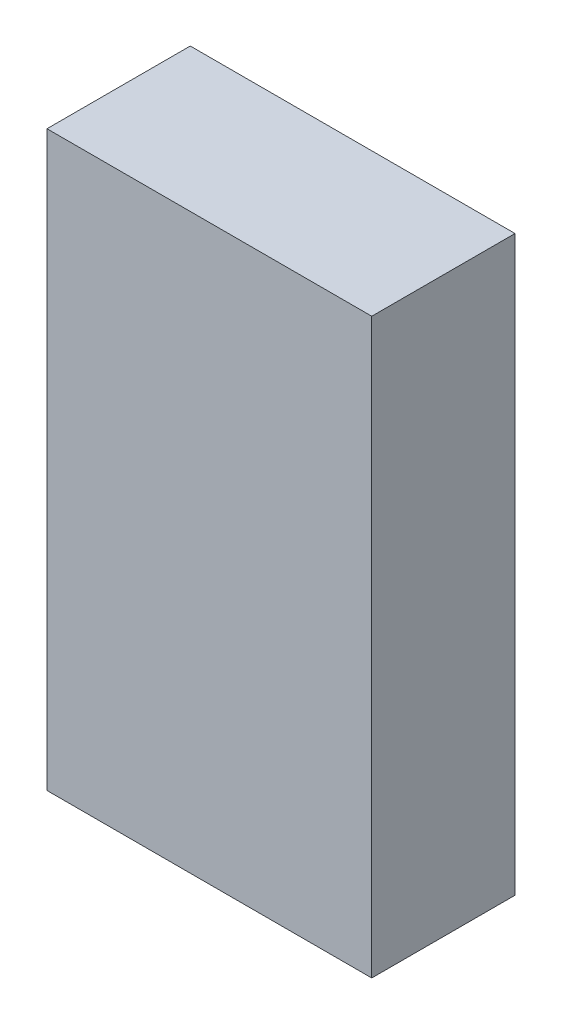
ISO-10303-21;
HEADER;
FILE_DESCRIPTION(('STEP AP214'),'2;1');
FILE_NAME('part.step','',(''),(''),'','','');
FILE_SCHEMA(('AUTOMOTIVE_DESIGN { 1 0 10303 214 1 1 1 1 }'));
ENDSEC;
DATA;
#1=APPLICATION_CONTEXT('core data for automotive mechanical design processes');
#2=APPLICATION_PROTOCOL_DEFINITION('international standard','automotive_design',2000,#1);
#3=PRODUCT_CONTEXT('',#1,'mechanical');
#4=PRODUCT('Part','Part','',(#3));
#5=PRODUCT_RELATED_PRODUCT_CATEGORY('part','',(#4));
#6=PRODUCT_DEFINITION_FORMATION('','',#4);
#7=PRODUCT_DEFINITION_CONTEXT('part definition',#1,'design');
#8=PRODUCT_DEFINITION('design','',#6,#7);
#9=PRODUCT_DEFINITION_SHAPE('','',#8);
#10=(LENGTH_UNIT() NAMED_UNIT(*) SI_UNIT(.MILLI.,.METRE.));
#11=(NAMED_UNIT(*) PLANE_ANGLE_UNIT() SI_UNIT($,.RADIAN.));
#12=(NAMED_UNIT(*) SI_UNIT($,.STERADIAN.) SOLID_ANGLE_UNIT());
#13=UNCERTAINTY_MEASURE_WITH_UNIT(LENGTH_MEASURE(1.E-05),#10,'distance_accuracy_value','');
#14=(GEOMETRIC_REPRESENTATION_CONTEXT(3) GLOBAL_UNCERTAINTY_ASSIGNED_CONTEXT((#13)) GLOBAL_UNIT_ASSIGNED_CONTEXT((#10,
#11,#12)) REPRESENTATION_CONTEXT('',''));
#15=CARTESIAN_POINT('',(0.,0.,0.));
#16=DIRECTION('',(0.,0.,1.));
#17=DIRECTION('',(1.,0.,0.));
#18=AXIS2_PLACEMENT_3D('',#15,#16,#17);
#19=CARTESIAN_POINT('',(8.5,-15.,7.5));
#20=DIRECTION('',(-1.,0.,0.));
#21=DIRECTION('',(0.,0.,1.));
#22=AXIS2_PLACEMENT_3D('',#19,#20,#21);
#23=PLANE('',#22);
#24=DIRECTION('',(0.,1.,0.));
#25=VECTOR('',#24,1.);
#26=CARTESIAN_POINT('',(8.5,-15.,0.));
#27=LINE('',#26,#25);
#28=CARTESIAN_POINT('',(8.5,-15.,0.));
#29=VERTEX_POINT('',#28);
#30=CARTESIAN_POINT('',(8.5,15.,0.));
#31=VERTEX_POINT('',#30);
#32=EDGE_CURVE('E102',#29,#31,#27,.T.);
#33=ORIENTED_EDGE('',*,*,#32,.T.);
#34=DIRECTION('',(0.,0.,-1.));
#35=VECTOR('',#34,1.);
#36=CARTESIAN_POINT('',(8.5,15.,7.5));
#37=LINE('',#36,#35);
#38=CARTESIAN_POINT('',(8.5,15.,7.5));
#39=VERTEX_POINT('',#38);
#40=EDGE_CURVE('E11',#39,#31,#37,.T.);
#41=ORIENTED_EDGE('',*,*,#40,.F.);
#42=DIRECTION('',(0.,1.,0.));
#43=VECTOR('',#42,1.);
#44=CARTESIAN_POINT('',(8.5,-15.,7.5));
#45=LINE('',#44,#43);
#46=CARTESIAN_POINT('',(8.5,-15.,7.5));
#47=VERTEX_POINT('',#46);
#48=EDGE_CURVE('E90',#47,#39,#45,.T.);
#49=ORIENTED_EDGE('',*,*,#48,.F.);
#50=DIRECTION('',(0.,0.,-1.));
#51=VECTOR('',#50,1.);
#52=CARTESIAN_POINT('',(8.5,-15.,7.5));
#53=LINE('',#52,#51);
#54=EDGE_CURVE('E98',#47,#29,#53,.T.);
#55=ORIENTED_EDGE('',*,*,#54,.T.);
#56=EDGE_LOOP('',(#33,#41,#49,#55));
#57=FACE_BOUND('',#56,.T.);
#58=ADVANCED_FACE('F39',(#57),#23,.F.);
#59=CARTESIAN_POINT('',(-8.5,15.,7.5));
#60=DIRECTION('',(0.,-1.,0.));
#61=DIRECTION('',(0.,0.,-1.));
#62=AXIS2_PLACEMENT_3D('',#59,#60,#61);
#63=PLANE('',#62);
#64=DIRECTION('',(-1.,0.,0.));
#65=VECTOR('',#64,1.);
#66=CARTESIAN_POINT('',(-8.5,15.,0.));
#67=LINE('',#66,#65);
#68=CARTESIAN_POINT('',(-8.5,15.,0.));
#69=VERTEX_POINT('',#68);
#70=EDGE_CURVE('E94',#31,#69,#67,.T.);
#71=ORIENTED_EDGE('',*,*,#70,.T.);
#72=DIRECTION('',(0.,0.,-1.));
#73=VECTOR('',#72,1.);
#74=CARTESIAN_POINT('',(-8.5,15.,7.5));
#75=LINE('',#74,#73);
#76=CARTESIAN_POINT('',(-8.5,15.,7.5));
#77=VERTEX_POINT('',#76);
#78=EDGE_CURVE('E47',#77,#69,#75,.T.);
#79=ORIENTED_EDGE('',*,*,#78,.F.);
#80=DIRECTION('',(-1.,0.,0.));
#81=VECTOR('',#80,1.);
#82=CARTESIAN_POINT('',(-8.5,15.,7.5));
#83=LINE('',#82,#81);
#84=EDGE_CURVE('E85',#39,#77,#83,.T.);
#85=ORIENTED_EDGE('',*,*,#84,.F.);
#86=ORIENTED_EDGE('',*,*,#40,.T.);
#87=EDGE_LOOP('',(#71,#79,#85,#86));
#88=FACE_BOUND('',#87,.T.);
#89=ADVANCED_FACE('F93',(#88),#63,.F.);
#90=CARTESIAN_POINT('',(-8.5,-15.,7.5));
#91=DIRECTION('',(1.,0.,0.));
#92=DIRECTION('',(0.,0.,-1.));
#93=AXIS2_PLACEMENT_3D('',#90,#91,#92);
#94=PLANE('',#93);
#95=DIRECTION('',(0.,-1.,0.));
#96=VECTOR('',#95,1.);
#97=CARTESIAN_POINT('',(-8.5,-15.,0.));
#98=LINE('',#97,#96);
#99=CARTESIAN_POINT('',(-8.5,-15.,0.));
#100=VERTEX_POINT('',#99);
#101=EDGE_CURVE('E72',#69,#100,#98,.T.);
#102=ORIENTED_EDGE('',*,*,#101,.T.);
#103=DIRECTION('',(0.,0.,-1.));
#104=VECTOR('',#103,1.);
#105=CARTESIAN_POINT('',(-8.5,-15.,7.5));
#106=LINE('',#105,#104);
#107=CARTESIAN_POINT('',(-8.5,-15.,7.5));
#108=VERTEX_POINT('',#107);
#109=EDGE_CURVE('E95',#108,#100,#106,.T.);
#110=ORIENTED_EDGE('',*,*,#109,.F.);
#111=DIRECTION('',(0.,-1.,0.));
#112=VECTOR('',#111,1.);
#113=CARTESIAN_POINT('',(-8.5,-15.,7.5));
#114=LINE('',#113,#112);
#115=EDGE_CURVE('E88',#77,#108,#114,.T.);
#116=ORIENTED_EDGE('',*,*,#115,.F.);
#117=ORIENTED_EDGE('',*,*,#78,.T.);
#118=EDGE_LOOP('',(#102,#110,#116,#117));
#119=FACE_BOUND('',#118,.T.);
#120=ADVANCED_FACE('F96',(#119),#94,.F.);
#121=CARTESIAN_POINT('',(-8.5,-15.,7.5));
#122=DIRECTION('',(0.,1.,0.));
#123=DIRECTION('',(0.,0.,1.));
#124=AXIS2_PLACEMENT_3D('',#121,#122,#123);
#125=PLANE('',#124);
#126=DIRECTION('',(1.,0.,0.));
#127=VECTOR('',#126,1.);
#128=CARTESIAN_POINT('',(-8.5,-15.,0.));
#129=LINE('',#128,#127);
#130=EDGE_CURVE('E78',#100,#29,#129,.T.);
#131=ORIENTED_EDGE('',*,*,#130,.T.);
#132=ORIENTED_EDGE('',*,*,#54,.F.);
#133=DIRECTION('',(1.,0.,0.));
#134=VECTOR('',#133,1.);
#135=CARTESIAN_POINT('',(-8.5,-15.,7.5));
#136=LINE('',#135,#134);
#137=EDGE_CURVE('E55',#108,#47,#136,.T.);
#138=ORIENTED_EDGE('',*,*,#137,.F.);
#139=ORIENTED_EDGE('',*,*,#109,.T.);
#140=EDGE_LOOP('',(#131,#132,#138,#139));
#141=FACE_BOUND('',#140,.T.);
#142=ADVANCED_FACE('F109',(#141),#125,.F.);
#143=CARTESIAN_POINT('',(0.,0.,7.5));
#144=DIRECTION('',(0.,0.,-1.));
#145=DIRECTION('',(-1.,0.,0.));
#146=AXIS2_PLACEMENT_3D('',#143,#144,#145);
#147=PLANE('',#146);
#148=ORIENTED_EDGE('',*,*,#48,.T.);
#149=ORIENTED_EDGE('',*,*,#84,.T.);
#150=ORIENTED_EDGE('',*,*,#115,.T.);
#151=ORIENTED_EDGE('',*,*,#137,.T.);
#152=EDGE_LOOP('',(#148,#149,#150,#151));
#153=FACE_BOUND('',#152,.T.);
#154=ADVANCED_FACE('F86',(#153),#147,.F.);
#155=CARTESIAN_POINT('',(0.,0.,0.));
#156=DIRECTION('',(0.,0.,-1.));
#157=DIRECTION('',(-1.,0.,0.));
#158=AXIS2_PLACEMENT_3D('',#155,#156,#157);
#159=PLANE('',#158);
#160=ORIENTED_EDGE('',*,*,#32,.F.);
#161=ORIENTED_EDGE('',*,*,#130,.F.);
#162=ORIENTED_EDGE('',*,*,#101,.F.);
#163=ORIENTED_EDGE('',*,*,#70,.F.);
#164=EDGE_LOOP('',(#160,#161,#162,#163));
#165=FACE_BOUND('',#164,.T.);
#166=ADVANCED_FACE('F112',(#165),#159,.T.);
#167=CLOSED_SHELL('',(#58,#89,#120,#142,#154,#166));
#168=MANIFOLD_SOLID_BREP('B2',#167);
#169=ADVANCED_BREP_SHAPE_REPRESENTATION('',(#18,#168),#14);
#170=SHAPE_DEFINITION_REPRESENTATION(#9,#169);
ENDSEC;
END-ISO-10303-21;
